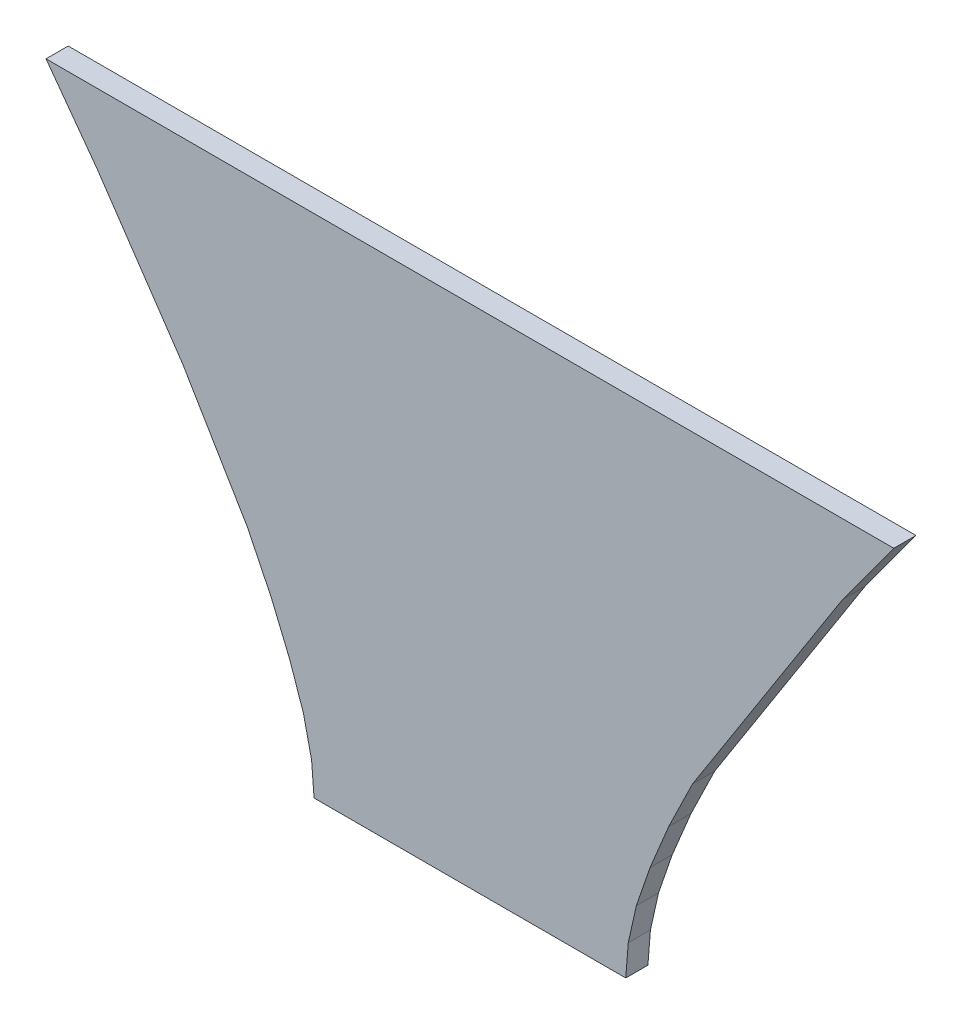
ISO-10303-21;
HEADER;
FILE_DESCRIPTION(('STEP AP214'),'2;1');
FILE_NAME('part.step','',(''),(''),'','','');
FILE_SCHEMA(('AUTOMOTIVE_DESIGN { 1 0 10303 214 1 1 1 1 }'));
ENDSEC;
DATA;
#1=APPLICATION_CONTEXT('core data for automotive mechanical design processes');
#2=APPLICATION_PROTOCOL_DEFINITION('international standard','automotive_design',2000,#1);
#3=PRODUCT_CONTEXT('',#1,'mechanical');
#4=PRODUCT('Part','Part','',(#3));
#5=PRODUCT_RELATED_PRODUCT_CATEGORY('part','',(#4));
#6=PRODUCT_DEFINITION_FORMATION('','',#4);
#7=PRODUCT_DEFINITION_CONTEXT('part definition',#1,'design');
#8=PRODUCT_DEFINITION('design','',#6,#7);
#9=PRODUCT_DEFINITION_SHAPE('','',#8);
#10=(LENGTH_UNIT() NAMED_UNIT(*) SI_UNIT(.MILLI.,.METRE.));
#11=(NAMED_UNIT(*) PLANE_ANGLE_UNIT() SI_UNIT($,.RADIAN.));
#12=(NAMED_UNIT(*) SI_UNIT($,.STERADIAN.) SOLID_ANGLE_UNIT());
#13=UNCERTAINTY_MEASURE_WITH_UNIT(LENGTH_MEASURE(1.E-05),#10,'distance_accuracy_value','');
#14=(GEOMETRIC_REPRESENTATION_CONTEXT(3) GLOBAL_UNCERTAINTY_ASSIGNED_CONTEXT((#13)) GLOBAL_UNIT_ASSIGNED_CONTEXT((#10,
#11,#12)) REPRESENTATION_CONTEXT('',''));
#15=CARTESIAN_POINT('',(0.,0.,0.));
#16=DIRECTION('',(0.,0.,1.));
#17=DIRECTION('',(1.,0.,0.));
#18=AXIS2_PLACEMENT_3D('',#15,#16,#17);
#19=CARTESIAN_POINT('',(67.8300018310547,61.2779998779297,0.));
#20=DIRECTION('',(-0.996941568410366,0.0781505545436505,0.));
#21=DIRECTION('',(0.0781505545436505,0.996941568410366,0.));
#22=AXIS2_PLACEMENT_3D('',#19,#20,#21);
#23=PLANE('',#22);
#24=DIRECTION('',(0.0781505545436505,0.996941568410366,0.));
#25=VECTOR('',#24,1.);
#26=CARTESIAN_POINT('',(67.8300018310547,61.2779998779297,0.03556));
#27=LINE('',#26,#25);
#28=CARTESIAN_POINT('',(67.8300018310547,61.2779998779297,0.03556));
#29=VERTEX_POINT('',#28);
#30=CARTESIAN_POINT('',(67.8339996337891,61.3289985656738,0.03556));
#31=VERTEX_POINT('',#30);
#32=EDGE_CURVE('E11',#29,#31,#27,.T.);
#33=ORIENTED_EDGE('',*,*,#32,.F.);
#34=DIRECTION('',(0.,0.,1.));
#35=VECTOR('',#34,1.);
#36=CARTESIAN_POINT('',(67.8300018310547,61.2779998779297,0.));
#37=LINE('',#36,#35);
#38=CARTESIAN_POINT('',(67.8300018310547,61.2779998779297,0.));
#39=VERTEX_POINT('',#38);
#40=EDGE_CURVE('E24',#39,#29,#37,.T.);
#41=ORIENTED_EDGE('',*,*,#40,.F.);
#42=DIRECTION('',(0.0781505545436505,0.996941568410366,0.));
#43=VECTOR('',#42,1.);
#44=CARTESIAN_POINT('',(67.8300018310547,61.2779998779297,0.));
#45=LINE('',#44,#43);
#46=CARTESIAN_POINT('',(67.8339996337891,61.3289985656738,0.));
#47=VERTEX_POINT('',#46);
#48=EDGE_CURVE('E154',#39,#47,#45,.T.);
#49=ORIENTED_EDGE('',*,*,#48,.T.);
#50=DIRECTION('',(0.,0.,1.));
#51=VECTOR('',#50,1.);
#52=CARTESIAN_POINT('',(67.8339996337891,61.3289985656738,0.));
#53=LINE('',#52,#51);
#54=EDGE_CURVE('E37',#47,#31,#53,.T.);
#55=ORIENTED_EDGE('',*,*,#54,.T.);
#56=EDGE_LOOP('',(#33,#41,#49,#55));
#57=FACE_BOUND('',#56,.T.);
#58=ADVANCED_FACE('F17',(#57),#23,.F.);
#59=CARTESIAN_POINT('',(67.8339996337891,61.3289985656738,0.));
#60=DIRECTION('',(-0.975789813155444,0.218710403369533,0.));
#61=DIRECTION('',(0.218710403369533,0.975789813155444,0.));
#62=AXIS2_PLACEMENT_3D('',#59,#60,#61);
#63=PLANE('',#62);
#64=DIRECTION('',(0.218710403369533,0.975789813155444,0.));
#65=VECTOR('',#64,1.);
#66=CARTESIAN_POINT('',(67.8339996337891,61.3289985656738,0.03556));
#67=LINE('',#66,#65);
#68=CARTESIAN_POINT('',(67.8470001220703,61.3870010375977,0.03556));
#69=VERTEX_POINT('',#68);
#70=EDGE_CURVE('E266',#31,#69,#67,.T.);
#71=ORIENTED_EDGE('',*,*,#70,.F.);
#72=ORIENTED_EDGE('',*,*,#54,.F.);
#73=DIRECTION('',(0.218710403369533,0.975789813155444,0.));
#74=VECTOR('',#73,1.);
#75=CARTESIAN_POINT('',(67.8339996337891,61.3289985656738,0.));
#76=LINE('',#75,#74);
#77=CARTESIAN_POINT('',(67.8470001220703,61.3870010375977,0.));
#78=VERTEX_POINT('',#77);
#79=EDGE_CURVE('E263',#47,#78,#76,.T.);
#80=ORIENTED_EDGE('',*,*,#79,.T.);
#81=DIRECTION('',(0.,0.,1.));
#82=VECTOR('',#81,1.);
#83=CARTESIAN_POINT('',(67.8470001220703,61.3870010375977,0.));
#84=LINE('',#83,#82);
#85=EDGE_CURVE('E261',#78,#69,#84,.T.);
#86=ORIENTED_EDGE('',*,*,#85,.T.);
#87=EDGE_LOOP('',(#71,#72,#80,#86));
#88=FACE_BOUND('',#87,.T.);
#89=ADVANCED_FACE('F274',(#88),#63,.F.);
#90=CARTESIAN_POINT('',(67.8470001220703,61.3870010375977,0.));
#91=DIRECTION('',(-0.945670894178699,0.325125452561408,0.));
#92=DIRECTION('',(0.325125452561408,0.945670894178699,0.));
#93=AXIS2_PLACEMENT_3D('',#90,#91,#92);
#94=PLANE('',#93);
#95=DIRECTION('',(0.325125452561408,0.945670894178699,0.));
#96=VECTOR('',#95,1.);
#97=CARTESIAN_POINT('',(67.8470001220703,61.3870010375977,0.03556));
#98=LINE('',#97,#96);
#99=CARTESIAN_POINT('',(67.8690032958984,61.451000213623,0.03556));
#100=VERTEX_POINT('',#99);
#101=EDGE_CURVE('E258',#69,#100,#98,.T.);
#102=ORIENTED_EDGE('',*,*,#101,.F.);
#103=ORIENTED_EDGE('',*,*,#85,.F.);
#104=DIRECTION('',(0.325125452561408,0.945670894178699,0.));
#105=VECTOR('',#104,1.);
#106=CARTESIAN_POINT('',(67.8470001220703,61.3870010375977,0.));
#107=LINE('',#106,#105);
#108=CARTESIAN_POINT('',(67.8690032958984,61.451000213623,0.));
#109=VERTEX_POINT('',#108);
#110=EDGE_CURVE('E255',#78,#109,#107,.T.);
#111=ORIENTED_EDGE('',*,*,#110,.T.);
#112=DIRECTION('',(0.,0.,1.));
#113=VECTOR('',#112,1.);
#114=CARTESIAN_POINT('',(67.8690032958984,61.451000213623,0.));
#115=LINE('',#114,#113);
#116=EDGE_CURVE('E253',#109,#100,#115,.T.);
#117=ORIENTED_EDGE('',*,*,#116,.T.);
#118=EDGE_LOOP('',(#102,#103,#111,#117));
#119=FACE_BOUND('',#118,.T.);
#120=ADVANCED_FACE('F280',(#119),#94,.F.);
#121=CARTESIAN_POINT('',(67.8690032958984,61.451000213623,0.));
#122=DIRECTION('',(-0.923079816984645,0.384608439163254,0.));
#123=DIRECTION('',(0.384608439163254,0.923079816984645,0.));
#124=AXIS2_PLACEMENT_3D('',#121,#122,#123);
#125=PLANE('',#124);
#126=DIRECTION('',(0.384608439163254,0.923079816984645,0.));
#127=VECTOR('',#126,1.);
#128=CARTESIAN_POINT('',(67.8690032958984,61.451000213623,0.03556));
#129=LINE('',#128,#127);
#130=CARTESIAN_POINT('',(67.8990020751953,61.5229988098144,0.03556));
#131=VERTEX_POINT('',#130);
#132=EDGE_CURVE('E250',#100,#131,#129,.T.);
#133=ORIENTED_EDGE('',*,*,#132,.F.);
#134=ORIENTED_EDGE('',*,*,#116,.F.);
#135=DIRECTION('',(0.384608439163254,0.923079816984645,0.));
#136=VECTOR('',#135,1.);
#137=CARTESIAN_POINT('',(67.8690032958984,61.451000213623,0.));
#138=LINE('',#137,#136);
#139=CARTESIAN_POINT('',(67.8990020751953,61.5229988098144,0.));
#140=VERTEX_POINT('',#139);
#141=EDGE_CURVE('E247',#109,#140,#138,.T.);
#142=ORIENTED_EDGE('',*,*,#141,.T.);
#143=DIRECTION('',(0.,0.,1.));
#144=VECTOR('',#143,1.);
#145=CARTESIAN_POINT('',(67.8990020751953,61.5229988098144,0.));
#146=LINE('',#145,#144);
#147=EDGE_CURVE('E245',#140,#131,#146,.T.);
#148=ORIENTED_EDGE('',*,*,#147,.T.);
#149=EDGE_LOOP('',(#133,#134,#142,#148));
#150=FACE_BOUND('',#149,.T.);
#151=ADVANCED_FACE('F282',(#150),#125,.F.);
#152=CARTESIAN_POINT('',(67.8990020751953,61.5229988098144,0.));
#153=DIRECTION('',(-0.899021824906345,0.437903823164476,0.));
#154=DIRECTION('',(0.437903823164476,0.899021824906345,0.));
#155=AXIS2_PLACEMENT_3D('',#152,#153,#154);
#156=PLANE('',#155);
#157=DIRECTION('',(0.437903823164476,0.899021824906345,0.));
#158=VECTOR('',#157,1.);
#159=CARTESIAN_POINT('',(67.8990020751953,61.5229988098144,0.03556));
#160=LINE('',#159,#158);
#161=CARTESIAN_POINT('',(67.9369964599609,61.601001739502,0.03556));
#162=VERTEX_POINT('',#161);
#163=EDGE_CURVE('E242',#131,#162,#160,.T.);
#164=ORIENTED_EDGE('',*,*,#163,.F.);
#165=ORIENTED_EDGE('',*,*,#147,.F.);
#166=DIRECTION('',(0.437903823164476,0.899021824906345,0.));
#167=VECTOR('',#166,1.);
#168=CARTESIAN_POINT('',(67.8990020751953,61.5229988098144,0.));
#169=LINE('',#168,#167);
#170=CARTESIAN_POINT('',(67.9369964599609,61.601001739502,0.));
#171=VERTEX_POINT('',#170);
#172=EDGE_CURVE('E239',#140,#171,#169,.T.);
#173=ORIENTED_EDGE('',*,*,#172,.T.);
#174=DIRECTION('',(0.,0.,1.));
#175=VECTOR('',#174,1.);
#176=CARTESIAN_POINT('',(67.9369964599609,61.601001739502,0.));
#177=LINE('',#176,#175);
#178=EDGE_CURVE('E237',#171,#162,#177,.T.);
#179=ORIENTED_EDGE('',*,*,#178,.T.);
#180=EDGE_LOOP('',(#164,#165,#173,#179));
#181=FACE_BOUND('',#180,.T.);
#182=ADVANCED_FACE('F287',(#181),#156,.F.);
#183=CARTESIAN_POINT('',(67.9369964599609,61.601001739502,0.));
#184=DIRECTION('',(-0.842549675546683,0.538618644530784,0.));
#185=DIRECTION('',(0.538618644530784,0.842549675546683,0.));
#186=AXIS2_PLACEMENT_3D('',#183,#184,#185);
#187=PLANE('',#186);
#188=DIRECTION('',(0.538618644530784,0.842549675546683,0.));
#189=VECTOR('',#188,1.);
#190=CARTESIAN_POINT('',(67.9369964599609,61.601001739502,0.03556));
#191=LINE('',#190,#189);
#192=CARTESIAN_POINT('',(68.1780014038086,61.9780006408691,0.03556));
#193=VERTEX_POINT('',#192);
#194=EDGE_CURVE('E234',#162,#193,#191,.T.);
#195=ORIENTED_EDGE('',*,*,#194,.F.);
#196=ORIENTED_EDGE('',*,*,#178,.F.);
#197=DIRECTION('',(0.538618644530784,0.842549675546683,0.));
#198=VECTOR('',#197,1.);
#199=CARTESIAN_POINT('',(67.9369964599609,61.601001739502,0.));
#200=LINE('',#199,#198);
#201=CARTESIAN_POINT('',(68.1780014038086,61.9780006408691,0.));
#202=VERTEX_POINT('',#201);
#203=EDGE_CURVE('E231',#171,#202,#200,.T.);
#204=ORIENTED_EDGE('',*,*,#203,.T.);
#205=DIRECTION('',(0.,0.,1.));
#206=VECTOR('',#205,1.);
#207=CARTESIAN_POINT('',(68.1780014038086,61.9780006408691,0.));
#208=LINE('',#207,#206);
#209=EDGE_CURVE('E229',#202,#193,#208,.T.);
#210=ORIENTED_EDGE('',*,*,#209,.T.);
#211=EDGE_LOOP('',(#195,#196,#204,#210));
#212=FACE_BOUND('',#211,.T.);
#213=ADVANCED_FACE('F290',(#212),#187,.F.);
#214=CARTESIAN_POINT('',(68.1780014038086,61.9780006408691,0.));
#215=DIRECTION('',(-0.806859077576746,0.590743962247607,0.));
#216=DIRECTION('',(0.590743962247607,0.806859077576746,0.));
#217=AXIS2_PLACEMENT_3D('',#214,#215,#216);
#218=PLANE('',#217);
#219=DIRECTION('',(0.590743962247607,0.806859077576746,0.));
#220=VECTOR('',#219,1.);
#221=CARTESIAN_POINT('',(68.1780014038086,61.9780006408691,0.03556));
#222=LINE('',#221,#220);
#223=CARTESIAN_POINT('',(68.2600021362305,62.0900001525879,0.03556));
#224=VERTEX_POINT('',#223);
#225=EDGE_CURVE('E226',#193,#224,#222,.T.);
#226=ORIENTED_EDGE('',*,*,#225,.F.);
#227=ORIENTED_EDGE('',*,*,#209,.F.);
#228=DIRECTION('',(0.590743962247607,0.806859077576746,0.));
#229=VECTOR('',#228,1.);
#230=CARTESIAN_POINT('',(68.1780014038086,61.9780006408691,0.));
#231=LINE('',#230,#229);
#232=CARTESIAN_POINT('',(68.2600021362305,62.0900001525879,0.));
#233=VERTEX_POINT('',#232);
#234=EDGE_CURVE('E223',#202,#233,#231,.T.);
#235=ORIENTED_EDGE('',*,*,#234,.T.);
#236=DIRECTION('',(0.,0.,1.));
#237=VECTOR('',#236,1.);
#238=CARTESIAN_POINT('',(68.2600021362305,62.0900001525879,0.));
#239=LINE('',#238,#237);
#240=EDGE_CURVE('E221',#233,#224,#239,.T.);
#241=ORIENTED_EDGE('',*,*,#240,.T.);
#242=EDGE_LOOP('',(#226,#227,#235,#241));
#243=FACE_BOUND('',#242,.T.);
#244=ADVANCED_FACE('F295',(#243),#218,.F.);
#245=CARTESIAN_POINT('',(68.2600021362305,62.0900001525879,0.));
#246=DIRECTION('',(0.,-1.,0.));
#247=DIRECTION('',(-1.,0.,0.));
#248=AXIS2_PLACEMENT_3D('',#245,#246,#247);
#249=PLANE('',#248);
#250=DIRECTION('',(-1.,0.,0.));
#251=VECTOR('',#250,1.);
#252=CARTESIAN_POINT('',(68.2600021362305,62.0900001525879,0.03556));
#253=LINE('',#252,#251);
#254=CARTESIAN_POINT('',(66.9000015258789,62.0900001525879,0.03556));
#255=VERTEX_POINT('',#254);
#256=EDGE_CURVE('E218',#224,#255,#253,.T.);
#257=ORIENTED_EDGE('',*,*,#256,.F.);
#258=ORIENTED_EDGE('',*,*,#240,.F.);
#259=DIRECTION('',(-1.,0.,0.));
#260=VECTOR('',#259,1.);
#261=CARTESIAN_POINT('',(68.2600021362305,62.0900001525879,0.));
#262=LINE('',#261,#260);
#263=CARTESIAN_POINT('',(66.9000015258789,62.0900001525879,0.));
#264=VERTEX_POINT('',#263);
#265=EDGE_CURVE('E215',#233,#264,#262,.T.);
#266=ORIENTED_EDGE('',*,*,#265,.T.);
#267=DIRECTION('',(0.,0.,1.));
#268=VECTOR('',#267,1.);
#269=CARTESIAN_POINT('',(66.9000015258789,62.0900001525879,0.));
#270=LINE('',#269,#268);
#271=EDGE_CURVE('E213',#264,#255,#270,.T.);
#272=ORIENTED_EDGE('',*,*,#271,.T.);
#273=EDGE_LOOP('',(#257,#258,#266,#272));
#274=FACE_BOUND('',#273,.T.);
#275=ADVANCED_FACE('F298',(#274),#249,.F.);
#276=CARTESIAN_POINT('',(66.9000015258789,62.0900001525879,0.));
#277=DIRECTION('',(0.806859077576746,0.590743962247607,0.));
#278=DIRECTION('',(0.590743962247607,-0.806859077576746,0.));
#279=AXIS2_PLACEMENT_3D('',#276,#277,#278);
#280=PLANE('',#279);
#281=DIRECTION('',(0.590743962247607,-0.806859077576746,0.));
#282=VECTOR('',#281,1.);
#283=CARTESIAN_POINT('',(66.9000015258789,62.0900001525879,0.03556));
#284=LINE('',#283,#282);
#285=CARTESIAN_POINT('',(66.9820022583008,61.9780006408691,0.03556));
#286=VERTEX_POINT('',#285);
#287=EDGE_CURVE('E210',#255,#286,#284,.T.);
#288=ORIENTED_EDGE('',*,*,#287,.F.);
#289=ORIENTED_EDGE('',*,*,#271,.F.);
#290=DIRECTION('',(0.590743962247607,-0.806859077576746,0.));
#291=VECTOR('',#290,1.);
#292=CARTESIAN_POINT('',(66.9000015258789,62.0900001525879,0.));
#293=LINE('',#292,#291);
#294=CARTESIAN_POINT('',(66.9820022583008,61.9780006408691,0.));
#295=VERTEX_POINT('',#294);
#296=EDGE_CURVE('E207',#264,#295,#293,.T.);
#297=ORIENTED_EDGE('',*,*,#296,.T.);
#298=DIRECTION('',(0.,0.,1.));
#299=VECTOR('',#298,1.);
#300=CARTESIAN_POINT('',(66.9820022583008,61.9780006408691,0.));
#301=LINE('',#300,#299);
#302=EDGE_CURVE('E205',#295,#286,#301,.T.);
#303=ORIENTED_EDGE('',*,*,#302,.T.);
#304=EDGE_LOOP('',(#288,#289,#297,#303));
#305=FACE_BOUND('',#304,.T.);
#306=ADVANCED_FACE('F303',(#305),#280,.F.);
#307=CARTESIAN_POINT('',(66.9820022583008,61.9780006408691,0.));
#308=DIRECTION('',(0.827609315205206,0.561304570964436,0.));
#309=DIRECTION('',(0.561304570964436,-0.827609315205206,0.));
#310=AXIS2_PLACEMENT_3D('',#307,#308,#309);
#311=PLANE('',#310);
#312=DIRECTION('',(0.561304570964436,-0.827609315205206,0.));
#313=VECTOR('',#312,1.);
#314=CARTESIAN_POINT('',(66.9820022583008,61.9780006408691,0.03556));
#315=LINE('',#314,#313);
#316=CARTESIAN_POINT('',(67.1190032958984,61.7760009765625,0.03556));
#317=VERTEX_POINT('',#316);
#318=EDGE_CURVE('E202',#286,#317,#315,.T.);
#319=ORIENTED_EDGE('',*,*,#318,.F.);
#320=ORIENTED_EDGE('',*,*,#302,.F.);
#321=DIRECTION('',(0.561304570964436,-0.827609315205206,0.));
#322=VECTOR('',#321,1.);
#323=CARTESIAN_POINT('',(66.9820022583008,61.9780006408691,0.));
#324=LINE('',#323,#322);
#325=CARTESIAN_POINT('',(67.1190032958984,61.7760009765625,0.));
#326=VERTEX_POINT('',#325);
#327=EDGE_CURVE('E199',#295,#326,#324,.T.);
#328=ORIENTED_EDGE('',*,*,#327,.T.);
#329=DIRECTION('',(0.,0.,1.));
#330=VECTOR('',#329,1.);
#331=CARTESIAN_POINT('',(67.1190032958984,61.7760009765625,0.));
#332=LINE('',#331,#330);
#333=EDGE_CURVE('E197',#326,#317,#332,.T.);
#334=ORIENTED_EDGE('',*,*,#333,.T.);
#335=EDGE_LOOP('',(#319,#320,#328,#334));
#336=FACE_BOUND('',#335,.T.);
#337=ADVANCED_FACE('F306',(#336),#311,.F.);
#338=CARTESIAN_POINT('',(67.1190032958984,61.7760009765625,0.));
#339=DIRECTION('',(0.859659563633837,0.510867335668352,0.));
#340=DIRECTION('',(0.510867335668352,-0.859659563633837,0.));
#341=AXIS2_PLACEMENT_3D('',#338,#339,#340);
#342=PLANE('',#341);
#343=DIRECTION('',(0.510867335668352,-0.859659563633837,0.));
#344=VECTOR('',#343,1.);
#345=CARTESIAN_POINT('',(67.1190032958984,61.7760009765625,0.03556));
#346=LINE('',#345,#344);
#347=CARTESIAN_POINT('',(67.2229995727539,61.601001739502,0.03556));
#348=VERTEX_POINT('',#347);
#349=EDGE_CURVE('E194',#317,#348,#346,.T.);
#350=ORIENTED_EDGE('',*,*,#349,.F.);
#351=ORIENTED_EDGE('',*,*,#333,.F.);
#352=DIRECTION('',(0.510867335668352,-0.859659563633837,0.));
#353=VECTOR('',#352,1.);
#354=CARTESIAN_POINT('',(67.1190032958984,61.7760009765625,0.));
#355=LINE('',#354,#353);
#356=CARTESIAN_POINT('',(67.2229995727539,61.601001739502,0.));
#357=VERTEX_POINT('',#356);
#358=EDGE_CURVE('E191',#326,#357,#355,.T.);
#359=ORIENTED_EDGE('',*,*,#358,.T.);
#360=DIRECTION('',(0.,0.,1.));
#361=VECTOR('',#360,1.);
#362=CARTESIAN_POINT('',(67.2229995727539,61.601001739502,0.));
#363=LINE('',#362,#361);
#364=EDGE_CURVE('E189',#357,#348,#363,.T.);
#365=ORIENTED_EDGE('',*,*,#364,.T.);
#366=EDGE_LOOP('',(#350,#351,#359,#365));
#367=FACE_BOUND('',#366,.T.);
#368=ADVANCED_FACE('F311',(#367),#342,.F.);
#369=CARTESIAN_POINT('',(67.2229995727539,61.601001739502,0.));
#370=DIRECTION('',(0.898987205718001,0.437974889640196,0.));
#371=DIRECTION('',(0.437974889640196,-0.898987205718001,0.));
#372=AXIS2_PLACEMENT_3D('',#369,#370,#371);
#373=PLANE('',#372);
#374=DIRECTION('',(0.437974889640196,-0.898987205718,0.));
#375=VECTOR('',#374,1.);
#376=CARTESIAN_POINT('',(67.2229995727539,61.601001739502,0.03556));
#377=LINE('',#376,#375);
#378=CARTESIAN_POINT('',(67.2610015869141,61.5229988098144,0.03556));
#379=VERTEX_POINT('',#378);
#380=EDGE_CURVE('E186',#348,#379,#377,.T.);
#381=ORIENTED_EDGE('',*,*,#380,.F.);
#382=ORIENTED_EDGE('',*,*,#364,.F.);
#383=DIRECTION('',(0.437974889640196,-0.898987205718,0.));
#384=VECTOR('',#383,1.);
#385=CARTESIAN_POINT('',(67.2229995727539,61.601001739502,0.));
#386=LINE('',#385,#384);
#387=CARTESIAN_POINT('',(67.2610015869141,61.5229988098144,0.));
#388=VERTEX_POINT('',#387);
#389=EDGE_CURVE('E183',#357,#388,#386,.T.);
#390=ORIENTED_EDGE('',*,*,#389,.T.);
#391=DIRECTION('',(0.,0.,1.));
#392=VECTOR('',#391,1.);
#393=CARTESIAN_POINT('',(67.2610015869141,61.5229988098144,0.));
#394=LINE('',#393,#392);
#395=EDGE_CURVE('E181',#388,#379,#394,.T.);
#396=ORIENTED_EDGE('',*,*,#395,.T.);
#397=EDGE_LOOP('',(#381,#382,#390,#396));
#398=FACE_BOUND('',#397,.T.);
#399=ADVANCED_FACE('F314',(#398),#373,.F.);
#400=CARTESIAN_POINT('',(67.2610015869141,61.5229988098144,0.));
#401=DIRECTION('',(0.923079816984645,0.384608439163254,0.));
#402=DIRECTION('',(0.384608439163254,-0.923079816984645,0.));
#403=AXIS2_PLACEMENT_3D('',#400,#401,#402);
#404=PLANE('',#403);
#405=DIRECTION('',(0.384608439163254,-0.923079816984645,0.));
#406=VECTOR('',#405,1.);
#407=CARTESIAN_POINT('',(67.2610015869141,61.5229988098144,0.03556));
#408=LINE('',#407,#406);
#409=CARTESIAN_POINT('',(67.2910003662109,61.451000213623,0.03556));
#410=VERTEX_POINT('',#409);
#411=EDGE_CURVE('E178',#379,#410,#408,.T.);
#412=ORIENTED_EDGE('',*,*,#411,.F.);
#413=ORIENTED_EDGE('',*,*,#395,.F.);
#414=DIRECTION('',(0.384608439163254,-0.923079816984645,0.));
#415=VECTOR('',#414,1.);
#416=CARTESIAN_POINT('',(67.2610015869141,61.5229988098144,0.));
#417=LINE('',#416,#415);
#418=CARTESIAN_POINT('',(67.2910003662109,61.451000213623,0.));
#419=VERTEX_POINT('',#418);
#420=EDGE_CURVE('E175',#388,#419,#417,.T.);
#421=ORIENTED_EDGE('',*,*,#420,.T.);
#422=DIRECTION('',(0.,0.,1.));
#423=VECTOR('',#422,1.);
#424=CARTESIAN_POINT('',(67.2910003662109,61.451000213623,0.));
#425=LINE('',#424,#423);
#426=EDGE_CURVE('E173',#419,#410,#425,.T.);
#427=ORIENTED_EDGE('',*,*,#426,.T.);
#428=EDGE_LOOP('',(#412,#413,#421,#427));
#429=FACE_BOUND('',#428,.T.);
#430=ADVANCED_FACE('F319',(#429),#404,.F.);
#431=CARTESIAN_POINT('',(67.2910003662109,61.451000213623,0.));
#432=DIRECTION('',(0.945670894178699,0.325125452561408,0.));
#433=DIRECTION('',(0.325125452561408,-0.945670894178699,0.));
#434=AXIS2_PLACEMENT_3D('',#431,#432,#433);
#435=PLANE('',#434);
#436=DIRECTION('',(0.325125452561408,-0.945670894178699,0.));
#437=VECTOR('',#436,1.);
#438=CARTESIAN_POINT('',(67.2910003662109,61.451000213623,0.03556));
#439=LINE('',#438,#437);
#440=CARTESIAN_POINT('',(67.3130035400391,61.3870010375977,0.03556));
#441=VERTEX_POINT('',#440);
#442=EDGE_CURVE('E170',#410,#441,#439,.T.);
#443=ORIENTED_EDGE('',*,*,#442,.F.);
#444=ORIENTED_EDGE('',*,*,#426,.F.);
#445=DIRECTION('',(0.325125452561408,-0.945670894178699,0.));
#446=VECTOR('',#445,1.);
#447=CARTESIAN_POINT('',(67.2910003662109,61.451000213623,0.));
#448=LINE('',#447,#446);
#449=CARTESIAN_POINT('',(67.3130035400391,61.3870010375977,0.));
#450=VERTEX_POINT('',#449);
#451=EDGE_CURVE('E167',#419,#450,#448,.T.);
#452=ORIENTED_EDGE('',*,*,#451,.T.);
#453=DIRECTION('',(0.,0.,1.));
#454=VECTOR('',#453,1.);
#455=CARTESIAN_POINT('',(67.3130035400391,61.3870010375977,0.));
#456=LINE('',#455,#454);
#457=EDGE_CURVE('E165',#450,#441,#456,.T.);
#458=ORIENTED_EDGE('',*,*,#457,.T.);
#459=EDGE_LOOP('',(#443,#444,#452,#458));
#460=FACE_BOUND('',#459,.T.);
#461=ADVANCED_FACE('F322',(#460),#435,.F.);
#462=CARTESIAN_POINT('',(67.3130035400391,61.3870010375977,0.));
#463=DIRECTION('',(0.975817198386045,0.218588186629587,0.));
#464=DIRECTION('',(0.218588186629587,-0.975817198386045,0.));
#465=AXIS2_PLACEMENT_3D('',#462,#463,#464);
#466=PLANE('',#465);
#467=DIRECTION('',(0.218588186629587,-0.975817198386045,0.));
#468=VECTOR('',#467,1.);
#469=CARTESIAN_POINT('',(67.3130035400391,61.3870010375977,0.03556));
#470=LINE('',#469,#468);
#471=CARTESIAN_POINT('',(67.3259963989258,61.3289985656738,0.03556));
#472=VERTEX_POINT('',#471);
#473=EDGE_CURVE('E162',#441,#472,#470,.T.);
#474=ORIENTED_EDGE('',*,*,#473,.F.);
#475=ORIENTED_EDGE('',*,*,#457,.F.);
#476=DIRECTION('',(0.218588186629587,-0.975817198386045,0.));
#477=VECTOR('',#476,1.);
#478=CARTESIAN_POINT('',(67.3130035400391,61.3870010375977,0.));
#479=LINE('',#478,#477);
#480=CARTESIAN_POINT('',(67.3259963989258,61.3289985656738,0.));
#481=VERTEX_POINT('',#480);
#482=EDGE_CURVE('E160',#450,#481,#479,.T.);
#483=ORIENTED_EDGE('',*,*,#482,.T.);
#484=DIRECTION('',(0.,0.,1.));
#485=VECTOR('',#484,1.);
#486=CARTESIAN_POINT('',(67.3259963989258,61.3289985656738,0.));
#487=LINE('',#486,#485);
#488=EDGE_CURVE('E145',#481,#472,#487,.T.);
#489=ORIENTED_EDGE('',*,*,#488,.T.);
#490=EDGE_LOOP('',(#474,#475,#483,#489));
#491=FACE_BOUND('',#490,.T.);
#492=ADVANCED_FACE('F325',(#491),#466,.F.);
#493=CARTESIAN_POINT('',(67.3259963989258,61.3289985656738,0.));
#494=DIRECTION('',(0.996929937622056,0.0782987833422963,0.));
#495=DIRECTION('',(0.0782987833422963,-0.996929937622056,0.));
#496=AXIS2_PLACEMENT_3D('',#493,#494,#495);
#497=PLANE('',#496);
#498=DIRECTION('',(0.0782987833422963,-0.996929937622056,0.));
#499=VECTOR('',#498,1.);
#500=CARTESIAN_POINT('',(67.3259963989258,61.3289985656738,0.03556));
#501=LINE('',#500,#499);
#502=CARTESIAN_POINT('',(67.3300018310547,61.2779998779297,0.03556));
#503=VERTEX_POINT('',#502);
#504=EDGE_CURVE('E149',#472,#503,#501,.T.);
#505=ORIENTED_EDGE('',*,*,#504,.F.);
#506=ORIENTED_EDGE('',*,*,#488,.F.);
#507=DIRECTION('',(0.0782987833422963,-0.996929937622056,0.));
#508=VECTOR('',#507,1.);
#509=CARTESIAN_POINT('',(67.3259963989258,61.3289985656738,0.));
#510=LINE('',#509,#508);
#511=CARTESIAN_POINT('',(67.3300018310547,61.2779998779297,0.));
#512=VERTEX_POINT('',#511);
#513=EDGE_CURVE('E141',#481,#512,#510,.T.);
#514=ORIENTED_EDGE('',*,*,#513,.T.);
#515=DIRECTION('',(0.,0.,1.));
#516=VECTOR('',#515,1.);
#517=CARTESIAN_POINT('',(67.3300018310547,61.2779998779297,0.));
#518=LINE('',#517,#516);
#519=EDGE_CURVE('E131',#512,#503,#518,.T.);
#520=ORIENTED_EDGE('',*,*,#519,.T.);
#521=EDGE_LOOP('',(#505,#506,#514,#520));
#522=FACE_BOUND('',#521,.T.);
#523=ADVANCED_FACE('F144',(#522),#497,.F.);
#524=CARTESIAN_POINT('',(67.3300018310547,61.2779998779297,0.));
#525=DIRECTION('',(0.,1.,0.));
#526=DIRECTION('',(1.,0.,0.));
#527=AXIS2_PLACEMENT_3D('',#524,#525,#526);
#528=PLANE('',#527);
#529=DIRECTION('',(1.,0.,0.));
#530=VECTOR('',#529,1.);
#531=CARTESIAN_POINT('',(67.3300018310547,61.2779998779297,0.03556));
#532=LINE('',#531,#530);
#533=EDGE_CURVE('E137',#503,#29,#532,.T.);
#534=ORIENTED_EDGE('',*,*,#533,.F.);
#535=ORIENTED_EDGE('',*,*,#519,.F.);
#536=DIRECTION('',(1.,0.,0.));
#537=VECTOR('',#536,1.);
#538=CARTESIAN_POINT('',(67.3300018310547,61.2779998779297,0.));
#539=LINE('',#538,#537);
#540=EDGE_CURVE('E135',#512,#39,#539,.T.);
#541=ORIENTED_EDGE('',*,*,#540,.T.);
#542=ORIENTED_EDGE('',*,*,#40,.T.);
#543=EDGE_LOOP('',(#534,#535,#541,#542));
#544=FACE_BOUND('',#543,.T.);
#545=ADVANCED_FACE('F133',(#544),#528,.F.);
#546=CARTESIAN_POINT('',(67.8300018310547,61.2779998779297,0.));
#547=DIRECTION('',(0.,0.,1.));
#548=DIRECTION('',(1.,0.,0.));
#549=AXIS2_PLACEMENT_3D('',#546,#547,#548);
#550=PLANE('',#549);
#551=ORIENTED_EDGE('',*,*,#540,.F.);
#552=ORIENTED_EDGE('',*,*,#513,.F.);
#553=ORIENTED_EDGE('',*,*,#482,.F.);
#554=ORIENTED_EDGE('',*,*,#451,.F.);
#555=ORIENTED_EDGE('',*,*,#420,.F.);
#556=ORIENTED_EDGE('',*,*,#389,.F.);
#557=ORIENTED_EDGE('',*,*,#358,.F.);
#558=ORIENTED_EDGE('',*,*,#327,.F.);
#559=ORIENTED_EDGE('',*,*,#296,.F.);
#560=ORIENTED_EDGE('',*,*,#265,.F.);
#561=ORIENTED_EDGE('',*,*,#234,.F.);
#562=ORIENTED_EDGE('',*,*,#203,.F.);
#563=ORIENTED_EDGE('',*,*,#172,.F.);
#564=ORIENTED_EDGE('',*,*,#141,.F.);
#565=ORIENTED_EDGE('',*,*,#110,.F.);
#566=ORIENTED_EDGE('',*,*,#79,.F.);
#567=ORIENTED_EDGE('',*,*,#48,.F.);
#568=EDGE_LOOP('',(#551,#552,#553,#554,#555,#556,#557,#558,#559,#560,#561,#562,#563,#564,#565,
#566,#567));
#569=FACE_BOUND('',#568,.T.);
#570=ADVANCED_FACE('F152',(#569),#550,.F.);
#571=CARTESIAN_POINT('',(67.8300018310547,61.2779998779297,0.03556));
#572=DIRECTION('',(0.,0.,1.));
#573=DIRECTION('',(1.,0.,0.));
#574=AXIS2_PLACEMENT_3D('',#571,#572,#573);
#575=PLANE('',#574);
#576=ORIENTED_EDGE('',*,*,#32,.T.);
#577=ORIENTED_EDGE('',*,*,#70,.T.);
#578=ORIENTED_EDGE('',*,*,#101,.T.);
#579=ORIENTED_EDGE('',*,*,#132,.T.);
#580=ORIENTED_EDGE('',*,*,#163,.T.);
#581=ORIENTED_EDGE('',*,*,#194,.T.);
#582=ORIENTED_EDGE('',*,*,#225,.T.);
#583=ORIENTED_EDGE('',*,*,#256,.T.);
#584=ORIENTED_EDGE('',*,*,#287,.T.);
#585=ORIENTED_EDGE('',*,*,#318,.T.);
#586=ORIENTED_EDGE('',*,*,#349,.T.);
#587=ORIENTED_EDGE('',*,*,#380,.T.);
#588=ORIENTED_EDGE('',*,*,#411,.T.);
#589=ORIENTED_EDGE('',*,*,#442,.T.);
#590=ORIENTED_EDGE('',*,*,#473,.T.);
#591=ORIENTED_EDGE('',*,*,#504,.T.);
#592=ORIENTED_EDGE('',*,*,#533,.T.);
#593=EDGE_LOOP('',(#576,#577,#578,#579,#580,#581,#582,#583,#584,#585,#586,#587,#588,#589,#590,
#591,#592));
#594=FACE_BOUND('',#593,.T.);
#595=ADVANCED_FACE('F277',(#594),#575,.T.);
#596=CLOSED_SHELL('',(#58,#89,#120,#151,#182,#213,#244,#275,#306,#337,#368,#399,#430,#461,#492,
#523,#545,#570,#595));
#597=MANIFOLD_SOLID_BREP('B1',#596);
#598=ADVANCED_BREP_SHAPE_REPRESENTATION('',(#18,#597),#14);
#599=SHAPE_DEFINITION_REPRESENTATION(#9,#598);
ENDSEC;
END-ISO-10303-21;
